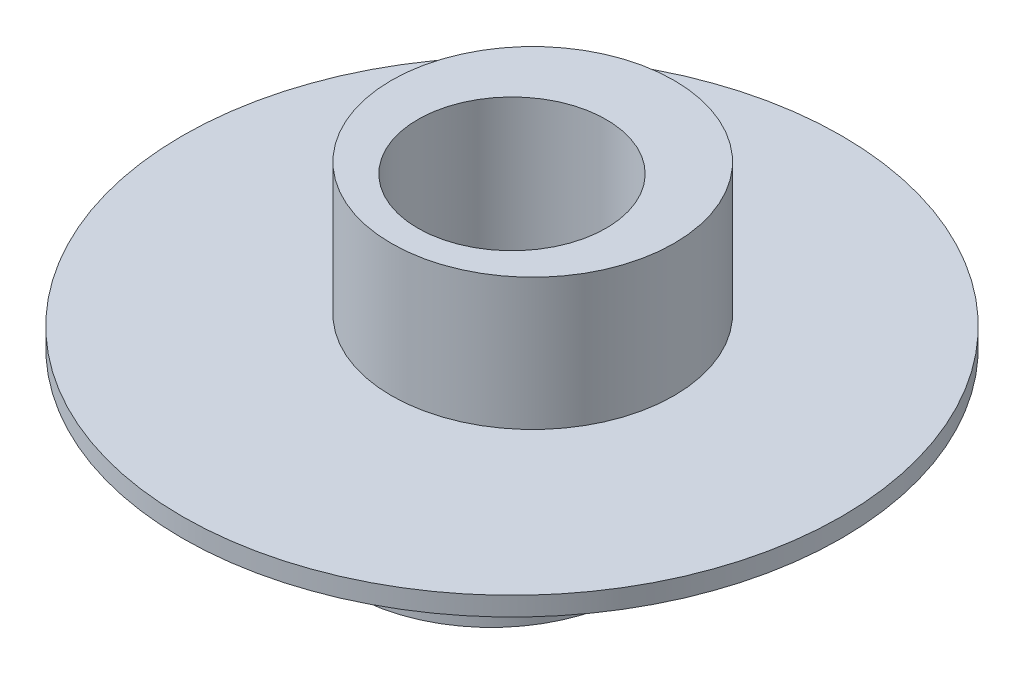
ISO-10303-21;
HEADER;
FILE_DESCRIPTION(('STEP AP214'),'2;1');
FILE_NAME('part.step','',(''),(''),'','','');
FILE_SCHEMA(('AUTOMOTIVE_DESIGN { 1 0 10303 214 1 1 1 1 }'));
ENDSEC;
DATA;
#1=APPLICATION_CONTEXT('core data for automotive mechanical design processes');
#2=APPLICATION_PROTOCOL_DEFINITION('international standard','automotive_design',2000,#1);
#3=PRODUCT_CONTEXT('',#1,'mechanical');
#4=PRODUCT('Part','Part','',(#3));
#5=PRODUCT_RELATED_PRODUCT_CATEGORY('part','',(#4));
#6=PRODUCT_DEFINITION_FORMATION('','',#4);
#7=PRODUCT_DEFINITION_CONTEXT('part definition',#1,'design');
#8=PRODUCT_DEFINITION('design','',#6,#7);
#9=PRODUCT_DEFINITION_SHAPE('','',#8);
#10=(LENGTH_UNIT() NAMED_UNIT(*) SI_UNIT(.MILLI.,.METRE.));
#11=(NAMED_UNIT(*) PLANE_ANGLE_UNIT() SI_UNIT($,.RADIAN.));
#12=(NAMED_UNIT(*) SI_UNIT($,.STERADIAN.) SOLID_ANGLE_UNIT());
#13=UNCERTAINTY_MEASURE_WITH_UNIT(LENGTH_MEASURE(1.E-05),#10,'distance_accuracy_value','');
#14=(GEOMETRIC_REPRESENTATION_CONTEXT(3) GLOBAL_UNCERTAINTY_ASSIGNED_CONTEXT((#13)) GLOBAL_UNIT_ASSIGNED_CONTEXT((#10,
#11,#12)) REPRESENTATION_CONTEXT('',''));
#15=CARTESIAN_POINT('',(0.,0.,0.));
#16=DIRECTION('',(0.,0.,1.));
#17=DIRECTION('',(1.,0.,0.));
#18=AXIS2_PLACEMENT_3D('',#15,#16,#17);
#19=CARTESIAN_POINT('',(0.,21.,1.1));
#20=DIRECTION('',(0.,-1.,0.));
#21=DIRECTION('',(0.,0.,-1.));
#22=AXIS2_PLACEMENT_3D('',#19,#20,#21);
#23=CYLINDRICAL_SURFACE('',#22,7.5);
#24=CARTESIAN_POINT('',(0.,20.,1.1));
#25=DIRECTION('',(0.,-1.,0.));
#26=DIRECTION('',(0.,0.,-1.));
#27=AXIS2_PLACEMENT_3D('',#24,#25,#26);
#28=CIRCLE('',#27,7.5);
#29=CARTESIAN_POINT('',(0.,20.,-6.4));
#30=VERTEX_POINT('',#29);
#31=EDGE_CURVE('E51',#30,#30,#28,.T.);
#32=ORIENTED_EDGE('',*,*,#31,.T.);
#33=EDGE_LOOP('',(#32));
#34=FACE_BOUND('',#33,.T.);
#35=CARTESIAN_POINT('',(0.,13.,1.1));
#36=DIRECTION('',(0.,1.,0.));
#37=DIRECTION('',(0.,0.,1.));
#38=AXIS2_PLACEMENT_3D('',#35,#36,#37);
#39=CIRCLE('',#38,7.5);
#40=CARTESIAN_POINT('',(0.,13.,8.6));
#41=VERTEX_POINT('',#40);
#42=EDGE_CURVE('E34',#41,#41,#39,.T.);
#43=ORIENTED_EDGE('',*,*,#42,.T.);
#44=EDGE_LOOP('',(#43));
#45=FACE_BOUND('',#44,.T.);
#46=ADVANCED_FACE('F31',(#34,#45),#23,.T.);
#47=CARTESIAN_POINT('',(0.,13.,1.1));
#48=DIRECTION('',(0.,1.,0.));
#49=DIRECTION('',(0.,0.,1.));
#50=AXIS2_PLACEMENT_3D('',#47,#48,#49);
#51=PLANE('',#50);
#52=CARTESIAN_POINT('',(0.,13.,0.));
#53=DIRECTION('',(0.,1.,0.));
#54=DIRECTION('',(0.,0.,1.));
#55=AXIS2_PLACEMENT_3D('',#52,#53,#54);
#56=CIRCLE('',#55,5.);
#57=CARTESIAN_POINT('',(0.,13.,5.));
#58=VERTEX_POINT('',#57);
#59=EDGE_CURVE('E45',#58,#58,#56,.T.);
#60=ORIENTED_EDGE('',*,*,#59,.T.);
#61=EDGE_LOOP('',(#60));
#62=FACE_BOUND('',#61,.T.);
#63=ORIENTED_EDGE('',*,*,#42,.F.);
#64=EDGE_LOOP('',(#63));
#65=FACE_BOUND('',#64,.T.);
#66=ADVANCED_FACE('F85',(#62,#65),#51,.F.);
#67=CARTESIAN_POINT('',(0.,41.,0.));
#68=DIRECTION('',(0.,-1.,0.));
#69=DIRECTION('',(0.,0.,-1.));
#70=AXIS2_PLACEMENT_3D('',#67,#68,#69);
#71=CYLINDRICAL_SURFACE('',#70,5.);
#72=ORIENTED_EDGE('',*,*,#59,.F.);
#73=EDGE_LOOP('',(#72));
#74=FACE_BOUND('',#73,.T.);
#75=CARTESIAN_POINT('',(0.,28.,0.));
#76=DIRECTION('',(0.,1.,0.));
#77=DIRECTION('',(0.,0.,1.));
#78=AXIS2_PLACEMENT_3D('',#75,#76,#77);
#79=CIRCLE('',#78,5.);
#80=CARTESIAN_POINT('',(0.,28.,5.));
#81=VERTEX_POINT('',#80);
#82=EDGE_CURVE('E48',#81,#81,#79,.T.);
#83=ORIENTED_EDGE('',*,*,#82,.T.);
#84=EDGE_LOOP('',(#83));
#85=FACE_BOUND('',#84,.T.);
#86=ADVANCED_FACE('F92',(#74,#85),#71,.F.);
#87=CARTESIAN_POINT('',(0.,20.,0.));
#88=DIRECTION('',(0.,-1.,0.));
#89=DIRECTION('',(0.,0.,-1.));
#90=AXIS2_PLACEMENT_3D('',#87,#88,#89);
#91=PLANE('',#90);
#92=CARTESIAN_POINT('',(0.,20.,0.));
#93=DIRECTION('',(0.,-1.,0.));
#94=DIRECTION('',(0.,0.,-1.));
#95=AXIS2_PLACEMENT_3D('',#92,#93,#94);
#96=CIRCLE('',#95,17.5);
#97=CARTESIAN_POINT('',(0.,20.,-17.5));
#98=VERTEX_POINT('',#97);
#99=EDGE_CURVE('E54',#98,#98,#96,.T.);
#100=ORIENTED_EDGE('',*,*,#99,.T.);
#101=EDGE_LOOP('',(#100));
#102=FACE_BOUND('',#101,.T.);
#103=ORIENTED_EDGE('',*,*,#31,.F.);
#104=EDGE_LOOP('',(#103));
#105=FACE_BOUND('',#104,.T.);
#106=ADVANCED_FACE('F61',(#102,#105),#91,.T.);
#107=CARTESIAN_POINT('',(0.,20.,0.));
#108=DIRECTION('',(0.,1.,0.));
#109=DIRECTION('',(0.,0.,1.));
#110=AXIS2_PLACEMENT_3D('',#107,#108,#109);
#111=CYLINDRICAL_SURFACE('',#110,17.5);
#112=ORIENTED_EDGE('',*,*,#99,.F.);
#113=EDGE_LOOP('',(#112));
#114=FACE_BOUND('',#113,.T.);
#115=CARTESIAN_POINT('',(0.,21.,0.));
#116=DIRECTION('',(0.,-1.,0.));
#117=DIRECTION('',(0.,0.,-1.));
#118=AXIS2_PLACEMENT_3D('',#115,#116,#117);
#119=CIRCLE('',#118,17.5);
#120=CARTESIAN_POINT('',(0.,21.,-17.5));
#121=VERTEX_POINT('',#120);
#122=EDGE_CURVE('E55',#121,#121,#119,.T.);
#123=ORIENTED_EDGE('',*,*,#122,.T.);
#124=EDGE_LOOP('',(#123));
#125=FACE_BOUND('',#124,.T.);
#126=ADVANCED_FACE('F64',(#114,#125),#111,.T.);
#127=CARTESIAN_POINT('',(0.,28.,-1.1));
#128=DIRECTION('',(0.,-1.,0.));
#129=DIRECTION('',(0.,0.,-1.));
#130=AXIS2_PLACEMENT_3D('',#127,#128,#129);
#131=CYLINDRICAL_SURFACE('',#130,7.5);
#132=CARTESIAN_POINT('',(0.,28.,-1.1));
#133=DIRECTION('',(0.,1.,0.));
#134=DIRECTION('',(0.,0.,1.));
#135=AXIS2_PLACEMENT_3D('',#132,#133,#134);
#136=CIRCLE('',#135,7.5);
#137=CARTESIAN_POINT('',(0.,28.,6.4));
#138=VERTEX_POINT('',#137);
#139=EDGE_CURVE('E41',#138,#138,#136,.T.);
#140=ORIENTED_EDGE('',*,*,#139,.F.);
#141=EDGE_LOOP('',(#140));
#142=FACE_BOUND('',#141,.T.);
#143=CARTESIAN_POINT('',(0.,21.,-1.1));
#144=DIRECTION('',(0.,1.,0.));
#145=DIRECTION('',(0.,0.,1.));
#146=AXIS2_PLACEMENT_3D('',#143,#144,#145);
#147=CIRCLE('',#146,7.5);
#148=CARTESIAN_POINT('',(0.,21.,6.4));
#149=VERTEX_POINT('',#148);
#150=EDGE_CURVE('E10',#149,#149,#147,.T.);
#151=ORIENTED_EDGE('',*,*,#150,.T.);
#152=EDGE_LOOP('',(#151));
#153=FACE_BOUND('',#152,.T.);
#154=ADVANCED_FACE('F67',(#142,#153),#131,.T.);
#155=CARTESIAN_POINT('',(0.,21.,1.1));
#156=DIRECTION('',(0.,1.,0.));
#157=DIRECTION('',(0.,0.,1.));
#158=AXIS2_PLACEMENT_3D('',#155,#156,#157);
#159=PLANE('',#158);
#160=ORIENTED_EDGE('',*,*,#150,.F.);
#161=EDGE_LOOP('',(#160));
#162=FACE_BOUND('',#161,.T.);
#163=ORIENTED_EDGE('',*,*,#122,.F.);
#164=EDGE_LOOP('',(#163));
#165=FACE_BOUND('',#164,.T.);
#166=ADVANCED_FACE('F71',(#162,#165),#159,.T.);
#167=CARTESIAN_POINT('',(0.,28.,-1.1));
#168=DIRECTION('',(0.,1.,0.));
#169=DIRECTION('',(0.,0.,1.));
#170=AXIS2_PLACEMENT_3D('',#167,#168,#169);
#171=PLANE('',#170);
#172=ORIENTED_EDGE('',*,*,#82,.F.);
#173=EDGE_LOOP('',(#172));
#174=FACE_BOUND('',#173,.T.);
#175=ORIENTED_EDGE('',*,*,#139,.T.);
#176=EDGE_LOOP('',(#175));
#177=FACE_BOUND('',#176,.T.);
#178=ADVANCED_FACE('F73',(#174,#177),#171,.T.);
#179=CLOSED_SHELL('',(#46,#66,#86,#106,#126,#154,#166,#178));
#180=MANIFOLD_SOLID_BREP('B2',#179);
#181=ADVANCED_BREP_SHAPE_REPRESENTATION('',(#18,#180),#14);
#182=SHAPE_DEFINITION_REPRESENTATION(#9,#181);
ENDSEC;
END-ISO-10303-21;
